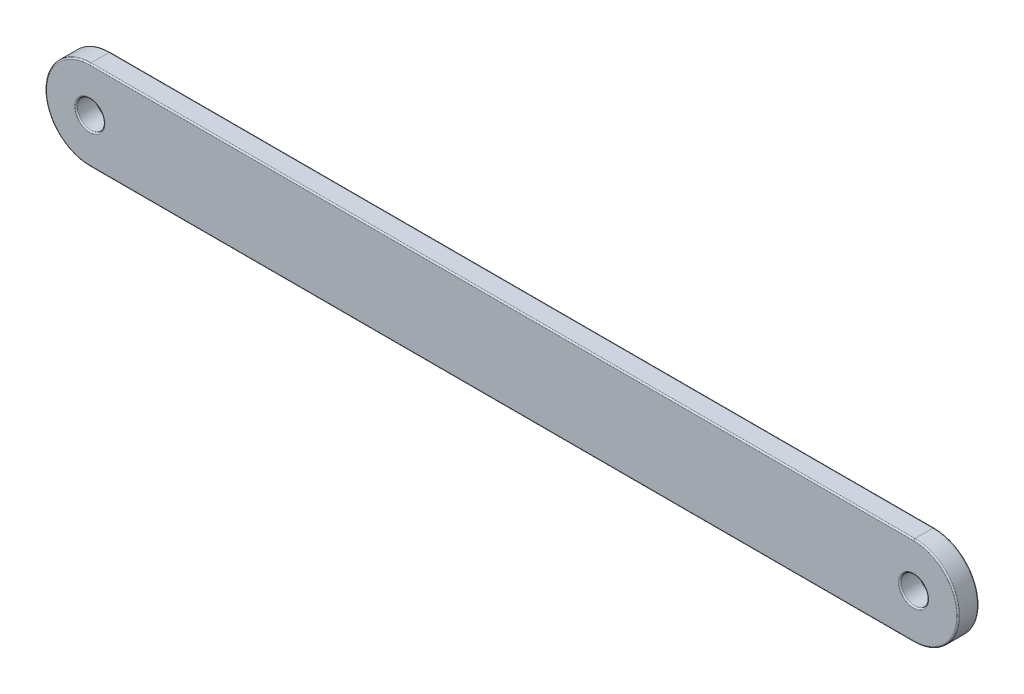
ISO-10303-21;
HEADER;
FILE_DESCRIPTION(('STEP AP214'),'2;1');
FILE_NAME('part.step','',(''),(''),'','','');
FILE_SCHEMA(('AUTOMOTIVE_DESIGN { 1 0 10303 214 1 1 1 1 }'));
ENDSEC;
DATA;
#1=APPLICATION_CONTEXT('core data for automotive mechanical design processes');
#2=APPLICATION_PROTOCOL_DEFINITION('international standard','automotive_design',2000,#1);
#3=PRODUCT_CONTEXT('',#1,'mechanical');
#4=PRODUCT('Part','Part','',(#3));
#5=PRODUCT_RELATED_PRODUCT_CATEGORY('part','',(#4));
#6=PRODUCT_DEFINITION_FORMATION('','',#4);
#7=PRODUCT_DEFINITION_CONTEXT('part definition',#1,'design');
#8=PRODUCT_DEFINITION('design','',#6,#7);
#9=PRODUCT_DEFINITION_SHAPE('','',#8);
#10=(LENGTH_UNIT() NAMED_UNIT(*) SI_UNIT(.MILLI.,.METRE.));
#11=(NAMED_UNIT(*) PLANE_ANGLE_UNIT() SI_UNIT($,.RADIAN.));
#12=(NAMED_UNIT(*) SI_UNIT($,.STERADIAN.) SOLID_ANGLE_UNIT());
#13=UNCERTAINTY_MEASURE_WITH_UNIT(LENGTH_MEASURE(1.E-05),#10,'distance_accuracy_value','');
#14=(GEOMETRIC_REPRESENTATION_CONTEXT(3) GLOBAL_UNCERTAINTY_ASSIGNED_CONTEXT((#13)) GLOBAL_UNIT_ASSIGNED_CONTEXT((#10,
#11,#12)) REPRESENTATION_CONTEXT('',''));
#15=CARTESIAN_POINT('',(0.,0.,0.));
#16=DIRECTION('',(0.,0.,1.));
#17=DIRECTION('',(1.,0.,0.));
#18=AXIS2_PLACEMENT_3D('',#15,#16,#17);
#19=CARTESIAN_POINT('',(-30.,0.,0.75));
#20=DIRECTION('',(0.,0.,1.));
#21=DIRECTION('',(1.,0.,0.));
#22=AXIS2_PLACEMENT_3D('',#19,#20,#21);
#23=PLANE('',#22);
#24=CARTESIAN_POINT('',(30.,0.,0.75));
#25=DIRECTION('',(0.,0.,1.));
#26=DIRECTION('',(1.,0.,0.));
#27=AXIS2_PLACEMENT_3D('',#24,#25,#26);
#28=CIRCLE('',#27,1.1);
#29=CARTESIAN_POINT('',(31.1,0.,0.75));
#30=VERTEX_POINT('',#29);
#31=EDGE_CURVE('E11',#30,#30,#28,.F.);
#32=ORIENTED_EDGE('',*,*,#31,.T.);
#33=EDGE_LOOP('',(#32));
#34=FACE_BOUND('',#33,.T.);
#35=CARTESIAN_POINT('',(30.,0.,0.75));
#36=DIRECTION('',(0.,0.,1.));
#37=DIRECTION('',(1.,0.,0.));
#38=AXIS2_PLACEMENT_3D('',#35,#36,#37);
#39=CIRCLE('',#38,3.15);
#40=CARTESIAN_POINT('',(30.,-3.14999999999999,0.75));
#41=VERTEX_POINT('',#40);
#42=CARTESIAN_POINT('',(30.,3.15000000000001,0.75));
#43=VERTEX_POINT('',#42);
#44=EDGE_CURVE('E61',#41,#43,#39,.T.);
#45=ORIENTED_EDGE('',*,*,#44,.T.);
#46=DIRECTION('',(-1.,0.,0.));
#47=VECTOR('',#46,1.);
#48=CARTESIAN_POINT('',(-30.,3.15,0.75));
#49=LINE('',#48,#47);
#50=CARTESIAN_POINT('',(-30.,3.15,0.75));
#51=VERTEX_POINT('',#50);
#52=EDGE_CURVE('E53',#43,#51,#49,.T.);
#53=ORIENTED_EDGE('',*,*,#52,.T.);
#54=CARTESIAN_POINT('',(-30.,0.,0.75));
#55=DIRECTION('',(0.,0.,1.));
#56=DIRECTION('',(1.,0.,0.));
#57=AXIS2_PLACEMENT_3D('',#54,#55,#56);
#58=CIRCLE('',#57,3.15);
#59=CARTESIAN_POINT('',(-30.,-3.15,0.75));
#60=VERTEX_POINT('',#59);
#61=EDGE_CURVE('E198',#51,#60,#58,.T.);
#62=ORIENTED_EDGE('',*,*,#61,.T.);
#63=DIRECTION('',(1.,0.,0.));
#64=VECTOR('',#63,1.);
#65=CARTESIAN_POINT('',(30.,-3.14999999999999,0.75));
#66=LINE('',#65,#64);
#67=EDGE_CURVE('E66',#60,#41,#66,.T.);
#68=ORIENTED_EDGE('',*,*,#67,.T.);
#69=EDGE_LOOP('',(#45,#53,#62,#68));
#70=FACE_BOUND('',#69,.T.);
#71=CARTESIAN_POINT('',(-30.,0.,0.75));
#72=DIRECTION('',(0.,0.,1.));
#73=DIRECTION('',(1.,0.,0.));
#74=AXIS2_PLACEMENT_3D('',#71,#72,#73);
#75=CIRCLE('',#74,1.1);
#76=CARTESIAN_POINT('',(-28.9,0.,0.75));
#77=VERTEX_POINT('',#76);
#78=EDGE_CURVE('E194',#77,#77,#75,.F.);
#79=ORIENTED_EDGE('',*,*,#78,.T.);
#80=EDGE_LOOP('',(#79));
#81=FACE_BOUND('',#80,.T.);
#82=ADVANCED_FACE('F43',(#34,#70,#81),#23,.T.);
#83=CARTESIAN_POINT('',(-30.,0.,-0.75));
#84=DIRECTION('',(0.,0.,1.));
#85=DIRECTION('',(1.,0.,0.));
#86=AXIS2_PLACEMENT_3D('',#83,#84,#85);
#87=PLANE('',#86);
#88=CARTESIAN_POINT('',(30.,0.,-0.75));
#89=DIRECTION('',(0.,0.,1.));
#90=DIRECTION('',(1.,0.,0.));
#91=AXIS2_PLACEMENT_3D('',#88,#89,#90);
#92=CIRCLE('',#91,1.1);
#93=CARTESIAN_POINT('',(31.1,0.,-0.75));
#94=VERTEX_POINT('',#93);
#95=EDGE_CURVE('E146',#94,#94,#92,.T.);
#96=ORIENTED_EDGE('',*,*,#95,.T.);
#97=EDGE_LOOP('',(#96));
#98=FACE_BOUND('',#97,.T.);
#99=CARTESIAN_POINT('',(-30.,0.,-0.75));
#100=DIRECTION('',(0.,0.,1.));
#101=DIRECTION('',(1.,0.,0.));
#102=AXIS2_PLACEMENT_3D('',#99,#100,#101);
#103=CIRCLE('',#102,1.1);
#104=CARTESIAN_POINT('',(-28.9,0.,-0.75));
#105=VERTEX_POINT('',#104);
#106=EDGE_CURVE('E141',#105,#105,#103,.T.);
#107=ORIENTED_EDGE('',*,*,#106,.T.);
#108=EDGE_LOOP('',(#107));
#109=FACE_BOUND('',#108,.T.);
#110=CARTESIAN_POINT('',(30.,0.,-0.75));
#111=DIRECTION('',(0.,0.,1.));
#112=DIRECTION('',(1.,0.,0.));
#113=AXIS2_PLACEMENT_3D('',#110,#111,#112);
#114=CIRCLE('',#113,3.15);
#115=CARTESIAN_POINT('',(30.,3.15000000000001,-0.75));
#116=VERTEX_POINT('',#115);
#117=CARTESIAN_POINT('',(30.,-3.14999999999999,-0.75));
#118=VERTEX_POINT('',#117);
#119=EDGE_CURVE('E139',#116,#118,#114,.F.);
#120=ORIENTED_EDGE('',*,*,#119,.T.);
#121=DIRECTION('',(1.,0.,0.));
#122=VECTOR('',#121,1.);
#123=CARTESIAN_POINT('',(-30.,-3.15,-0.75));
#124=LINE('',#123,#122);
#125=CARTESIAN_POINT('',(-30.,-3.15,-0.75));
#126=VERTEX_POINT('',#125);
#127=EDGE_CURVE('E116',#118,#126,#124,.F.);
#128=ORIENTED_EDGE('',*,*,#127,.T.);
#129=CARTESIAN_POINT('',(-30.,0.,-0.75));
#130=DIRECTION('',(0.,0.,1.));
#131=DIRECTION('',(1.,0.,0.));
#132=AXIS2_PLACEMENT_3D('',#129,#130,#131);
#133=CIRCLE('',#132,3.15);
#134=CARTESIAN_POINT('',(-30.,3.15,-0.75));
#135=VERTEX_POINT('',#134);
#136=EDGE_CURVE('E127',#126,#135,#133,.F.);
#137=ORIENTED_EDGE('',*,*,#136,.T.);
#138=DIRECTION('',(-1.,0.,0.));
#139=VECTOR('',#138,1.);
#140=CARTESIAN_POINT('',(-30.,3.15,-0.75));
#141=LINE('',#140,#139);
#142=EDGE_CURVE('E134',#135,#116,#141,.F.);
#143=ORIENTED_EDGE('',*,*,#142,.T.);
#144=EDGE_LOOP('',(#120,#128,#137,#143));
#145=FACE_BOUND('',#144,.T.);
#146=ADVANCED_FACE('F137',(#98,#109,#145),#87,.F.);
#147=CARTESIAN_POINT('',(-30.,0.,0.75));
#148=DIRECTION('',(0.,0.,-1.));
#149=DIRECTION('',(-1.,0.,0.));
#150=AXIS2_PLACEMENT_3D('',#147,#148,#149);
#151=CYLINDRICAL_SURFACE('',#150,3.25);
#152=DIRECTION('',(0.,0.,-1.));
#153=VECTOR('',#152,1.);
#154=CARTESIAN_POINT('',(-30.,3.25,0.75));
#155=LINE('',#154,#153);
#156=CARTESIAN_POINT('',(-30.,3.25,0.65));
#157=VERTEX_POINT('',#156);
#158=CARTESIAN_POINT('',(-30.,3.25,-0.65));
#159=VERTEX_POINT('',#158);
#160=EDGE_CURVE('E214',#157,#159,#155,.T.);
#161=ORIENTED_EDGE('',*,*,#160,.T.);
#162=CARTESIAN_POINT('',(-30.,0.,-0.65));
#163=DIRECTION('',(0.,0.,1.));
#164=DIRECTION('',(1.,0.,0.));
#165=AXIS2_PLACEMENT_3D('',#162,#163,#164);
#166=CIRCLE('',#165,3.25);
#167=CARTESIAN_POINT('',(-30.,-3.25,-0.65));
#168=VERTEX_POINT('',#167);
#169=EDGE_CURVE('E191',#159,#168,#166,.T.);
#170=ORIENTED_EDGE('',*,*,#169,.T.);
#171=DIRECTION('',(0.,0.,-1.));
#172=VECTOR('',#171,1.);
#173=CARTESIAN_POINT('',(-30.,-3.25,0.75));
#174=LINE('',#173,#172);
#175=CARTESIAN_POINT('',(-30.,-3.25,0.65));
#176=VERTEX_POINT('',#175);
#177=EDGE_CURVE('E135',#176,#168,#174,.T.);
#178=ORIENTED_EDGE('',*,*,#177,.F.);
#179=CARTESIAN_POINT('',(-30.,0.,0.65));
#180=DIRECTION('',(0.,0.,1.));
#181=DIRECTION('',(1.,0.,0.));
#182=AXIS2_PLACEMENT_3D('',#179,#180,#181);
#183=CIRCLE('',#182,3.25);
#184=EDGE_CURVE('E188',#176,#157,#183,.F.);
#185=ORIENTED_EDGE('',*,*,#184,.T.);
#186=EDGE_LOOP('',(#161,#170,#178,#185));
#187=FACE_BOUND('',#186,.T.);
#188=ADVANCED_FACE('F244',(#187),#151,.T.);
#189=CARTESIAN_POINT('',(-30.,-3.25,0.75));
#190=DIRECTION('',(0.,1.,0.));
#191=DIRECTION('',(-1.,0.,0.));
#192=AXIS2_PLACEMENT_3D('',#189,#190,#191);
#193=PLANE('',#192);
#194=ORIENTED_EDGE('',*,*,#177,.T.);
#195=DIRECTION('',(1.,0.,0.));
#196=VECTOR('',#195,1.);
#197=CARTESIAN_POINT('',(-30.,-3.25,-0.65));
#198=LINE('',#197,#196);
#199=CARTESIAN_POINT('',(30.,-3.24999999999999,-0.65));
#200=VERTEX_POINT('',#199);
#201=EDGE_CURVE('E119',#168,#200,#198,.T.);
#202=ORIENTED_EDGE('',*,*,#201,.T.);
#203=DIRECTION('',(0.,0.,-1.));
#204=VECTOR('',#203,1.);
#205=CARTESIAN_POINT('',(30.,-3.24999999999999,0.75));
#206=LINE('',#205,#204);
#207=CARTESIAN_POINT('',(30.,-3.24999999999999,0.65));
#208=VERTEX_POINT('',#207);
#209=EDGE_CURVE('E241',#208,#200,#206,.T.);
#210=ORIENTED_EDGE('',*,*,#209,.F.);
#211=DIRECTION('',(1.,0.,0.));
#212=VECTOR('',#211,1.);
#213=CARTESIAN_POINT('',(-30.,-3.25,0.65));
#214=LINE('',#213,#212);
#215=EDGE_CURVE('E170',#208,#176,#214,.F.);
#216=ORIENTED_EDGE('',*,*,#215,.T.);
#217=EDGE_LOOP('',(#194,#202,#210,#216));
#218=FACE_BOUND('',#217,.T.);
#219=ADVANCED_FACE('F239',(#218),#193,.F.);
#220=CARTESIAN_POINT('',(30.,0.,0.75));
#221=DIRECTION('',(0.,0.,-1.));
#222=DIRECTION('',(-1.,0.,0.));
#223=AXIS2_PLACEMENT_3D('',#220,#221,#222);
#224=CYLINDRICAL_SURFACE('',#223,3.25);
#225=ORIENTED_EDGE('',*,*,#209,.T.);
#226=CARTESIAN_POINT('',(30.,0.,-0.65));
#227=DIRECTION('',(0.,0.,1.));
#228=DIRECTION('',(1.,0.,0.));
#229=AXIS2_PLACEMENT_3D('',#226,#227,#228);
#230=CIRCLE('',#229,3.25);
#231=CARTESIAN_POINT('',(30.,3.25000000000001,-0.65));
#232=VERTEX_POINT('',#231);
#233=EDGE_CURVE('E178',#200,#232,#230,.T.);
#234=ORIENTED_EDGE('',*,*,#233,.T.);
#235=DIRECTION('',(0.,0.,-1.));
#236=VECTOR('',#235,1.);
#237=CARTESIAN_POINT('',(30.,3.25000000000001,0.75));
#238=LINE('',#237,#236);
#239=CARTESIAN_POINT('',(30.,3.25000000000001,0.65));
#240=VERTEX_POINT('',#239);
#241=EDGE_CURVE('E249',#240,#232,#238,.T.);
#242=ORIENTED_EDGE('',*,*,#241,.F.);
#243=CARTESIAN_POINT('',(30.,0.,0.65));
#244=DIRECTION('',(0.,0.,1.));
#245=DIRECTION('',(1.,0.,0.));
#246=AXIS2_PLACEMENT_3D('',#243,#244,#245);
#247=CIRCLE('',#246,3.25);
#248=EDGE_CURVE('E175',#240,#208,#247,.F.);
#249=ORIENTED_EDGE('',*,*,#248,.T.);
#250=EDGE_LOOP('',(#225,#234,#242,#249));
#251=FACE_BOUND('',#250,.T.);
#252=ADVANCED_FACE('F263',(#251),#224,.T.);
#253=CARTESIAN_POINT('',(-30.,3.25,0.75));
#254=DIRECTION('',(0.,-1.,0.));
#255=DIRECTION('',(1.,0.,0.));
#256=AXIS2_PLACEMENT_3D('',#253,#254,#255);
#257=PLANE('',#256);
#258=ORIENTED_EDGE('',*,*,#241,.T.);
#259=DIRECTION('',(-1.,0.,0.));
#260=VECTOR('',#259,1.);
#261=CARTESIAN_POINT('',(-30.,3.25,-0.65));
#262=LINE('',#261,#260);
#263=EDGE_CURVE('E185',#232,#159,#262,.T.);
#264=ORIENTED_EDGE('',*,*,#263,.T.);
#265=ORIENTED_EDGE('',*,*,#160,.F.);
#266=DIRECTION('',(-1.,0.,0.));
#267=VECTOR('',#266,1.);
#268=CARTESIAN_POINT('',(30.,3.25000000000001,0.65));
#269=LINE('',#268,#267);
#270=EDGE_CURVE('E181',#157,#240,#269,.F.);
#271=ORIENTED_EDGE('',*,*,#270,.T.);
#272=EDGE_LOOP('',(#258,#264,#265,#271));
#273=FACE_BOUND('',#272,.T.);
#274=ADVANCED_FACE('F269',(#273),#257,.F.);
#275=CARTESIAN_POINT('',(-30.,0.,0.75));
#276=DIRECTION('',(0.,0.,-1.));
#277=DIRECTION('',(-1.,0.,0.));
#278=AXIS2_PLACEMENT_3D('',#275,#276,#277);
#279=CYLINDRICAL_SURFACE('',#278,1.);
#280=CARTESIAN_POINT('',(-30.,0.,-0.65));
#281=DIRECTION('',(0.,0.,1.));
#282=DIRECTION('',(1.,0.,0.));
#283=AXIS2_PLACEMENT_3D('',#280,#281,#282);
#284=CIRCLE('',#283,1.);
#285=CARTESIAN_POINT('',(-29.,0.,-0.65));
#286=VERTEX_POINT('',#285);
#287=EDGE_CURVE('E166',#286,#286,#284,.F.);
#288=ORIENTED_EDGE('',*,*,#287,.T.);
#289=EDGE_LOOP('',(#288));
#290=FACE_BOUND('',#289,.T.);
#291=CARTESIAN_POINT('',(-30.,0.,0.65));
#292=DIRECTION('',(0.,0.,1.));
#293=DIRECTION('',(1.,0.,0.));
#294=AXIS2_PLACEMENT_3D('',#291,#292,#293);
#295=CIRCLE('',#294,1.);
#296=CARTESIAN_POINT('',(-29.,0.,0.65));
#297=VERTEX_POINT('',#296);
#298=EDGE_CURVE('E162',#297,#297,#295,.T.);
#299=ORIENTED_EDGE('',*,*,#298,.T.);
#300=EDGE_LOOP('',(#299));
#301=FACE_BOUND('',#300,.T.);
#302=ADVANCED_FACE('F285',(#290,#301),#279,.F.);
#303=CARTESIAN_POINT('',(30.,0.,0.75));
#304=DIRECTION('',(0.,0.,-1.));
#305=DIRECTION('',(-1.,0.,0.));
#306=AXIS2_PLACEMENT_3D('',#303,#304,#305);
#307=CYLINDRICAL_SURFACE('',#306,1.);
#308=CARTESIAN_POINT('',(30.,0.,-0.65));
#309=DIRECTION('',(0.,0.,1.));
#310=DIRECTION('',(1.,0.,0.));
#311=AXIS2_PLACEMENT_3D('',#308,#309,#310);
#312=CIRCLE('',#311,1.);
#313=CARTESIAN_POINT('',(31.,0.,-0.65));
#314=VERTEX_POINT('',#313);
#315=EDGE_CURVE('E158',#314,#314,#312,.F.);
#316=ORIENTED_EDGE('',*,*,#315,.T.);
#317=EDGE_LOOP('',(#316));
#318=FACE_BOUND('',#317,.T.);
#319=CARTESIAN_POINT('',(30.,0.,0.65));
#320=DIRECTION('',(0.,0.,1.));
#321=DIRECTION('',(1.,0.,0.));
#322=AXIS2_PLACEMENT_3D('',#319,#320,#321);
#323=CIRCLE('',#322,1.);
#324=CARTESIAN_POINT('',(31.,0.,0.65));
#325=VERTEX_POINT('',#324);
#326=EDGE_CURVE('E154',#325,#325,#323,.T.);
#327=ORIENTED_EDGE('',*,*,#326,.T.);
#328=EDGE_LOOP('',(#327));
#329=FACE_BOUND('',#328,.T.);
#330=ADVANCED_FACE('F287',(#318,#329),#307,.F.);
#331=CARTESIAN_POINT('',(30.,0.,-0.65));
#332=DIRECTION('',(0.,0.,1.));
#333=DIRECTION('',(1.,0.,0.));
#334=AXIS2_PLACEMENT_3D('',#331,#332,#333);
#335=TOROIDAL_SURFACE('',#334,1.1,0.1);
#336=ORIENTED_EDGE('',*,*,#315,.F.);
#337=EDGE_LOOP('',(#336));
#338=FACE_BOUND('',#337,.T.);
#339=ORIENTED_EDGE('',*,*,#95,.F.);
#340=EDGE_LOOP('',(#339));
#341=FACE_BOUND('',#340,.T.);
#342=ADVANCED_FACE('F294',(#338,#341),#335,.T.);
#343=CARTESIAN_POINT('',(-30.,0.,-0.65));
#344=DIRECTION('',(0.,0.,1.));
#345=DIRECTION('',(1.,0.,0.));
#346=AXIS2_PLACEMENT_3D('',#343,#344,#345);
#347=TOROIDAL_SURFACE('',#346,1.1,0.1);
#348=ORIENTED_EDGE('',*,*,#287,.F.);
#349=EDGE_LOOP('',(#348));
#350=FACE_BOUND('',#349,.T.);
#351=ORIENTED_EDGE('',*,*,#106,.F.);
#352=EDGE_LOOP('',(#351));
#353=FACE_BOUND('',#352,.T.);
#354=ADVANCED_FACE('F310',(#350,#353),#347,.T.);
#355=CARTESIAN_POINT('',(-30.,3.15,-0.65));
#356=DIRECTION('',(-1.,0.,0.));
#357=DIRECTION('',(0.,-1.,0.));
#358=AXIS2_PLACEMENT_3D('',#355,#356,#357);
#359=CYLINDRICAL_SURFACE('',#358,0.1);
#360=CARTESIAN_POINT('',(30.,3.15000000000001,-0.65));
#361=DIRECTION('',(1.,0.,0.));
#362=DIRECTION('',(0.,0.,-1.));
#363=AXIS2_PLACEMENT_3D('',#360,#361,#362);
#364=CIRCLE('',#363,0.1);
#365=EDGE_CURVE('E123',#116,#232,#364,.T.);
#366=ORIENTED_EDGE('',*,*,#365,.F.);
#367=ORIENTED_EDGE('',*,*,#142,.F.);
#368=CARTESIAN_POINT('',(-30.,3.15,-0.65));
#369=DIRECTION('',(-1.,0.,0.));
#370=DIRECTION('',(0.,0.,1.));
#371=AXIS2_PLACEMENT_3D('',#368,#369,#370);
#372=CIRCLE('',#371,0.1);
#373=EDGE_CURVE('E130',#159,#135,#372,.T.);
#374=ORIENTED_EDGE('',*,*,#373,.F.);
#375=ORIENTED_EDGE('',*,*,#263,.F.);
#376=EDGE_LOOP('',(#366,#367,#374,#375));
#377=FACE_BOUND('',#376,.T.);
#378=ADVANCED_FACE('F256',(#377),#359,.T.);
#379=CARTESIAN_POINT('',(-30.,0.,-0.65));
#380=DIRECTION('',(0.,0.,1.));
#381=DIRECTION('',(1.,0.,0.));
#382=AXIS2_PLACEMENT_3D('',#379,#380,#381);
#383=TOROIDAL_SURFACE('',#382,3.15,0.1);
#384=ORIENTED_EDGE('',*,*,#373,.T.);
#385=ORIENTED_EDGE('',*,*,#136,.F.);
#386=CARTESIAN_POINT('',(-30.,-3.15,-0.65));
#387=DIRECTION('',(1.,0.,0.));
#388=DIRECTION('',(0.,0.,-1.));
#389=AXIS2_PLACEMENT_3D('',#386,#387,#388);
#390=CIRCLE('',#389,0.1);
#391=EDGE_CURVE('E112',#168,#126,#390,.T.);
#392=ORIENTED_EDGE('',*,*,#391,.F.);
#393=ORIENTED_EDGE('',*,*,#169,.F.);
#394=EDGE_LOOP('',(#384,#385,#392,#393));
#395=FACE_BOUND('',#394,.T.);
#396=ADVANCED_FACE('F128',(#395),#383,.T.);
#397=CARTESIAN_POINT('',(30.,0.,-0.65));
#398=DIRECTION('',(0.,0.,1.));
#399=DIRECTION('',(1.,0.,0.));
#400=AXIS2_PLACEMENT_3D('',#397,#398,#399);
#401=TOROIDAL_SURFACE('',#400,3.15,0.1);
#402=ORIENTED_EDGE('',*,*,#365,.T.);
#403=ORIENTED_EDGE('',*,*,#233,.F.);
#404=CARTESIAN_POINT('',(30.,-3.14999999999999,-0.65));
#405=DIRECTION('',(-1.,0.,0.));
#406=DIRECTION('',(0.,0.,1.));
#407=AXIS2_PLACEMENT_3D('',#404,#405,#406);
#408=CIRCLE('',#407,0.1);
#409=EDGE_CURVE('E124',#118,#200,#408,.T.);
#410=ORIENTED_EDGE('',*,*,#409,.F.);
#411=ORIENTED_EDGE('',*,*,#119,.F.);
#412=EDGE_LOOP('',(#402,#403,#410,#411));
#413=FACE_BOUND('',#412,.T.);
#414=ADVANCED_FACE('F259',(#413),#401,.T.);
#415=CARTESIAN_POINT('',(-30.,-3.15,-0.65));
#416=DIRECTION('',(1.,0.,0.));
#417=DIRECTION('',(0.,1.,0.));
#418=AXIS2_PLACEMENT_3D('',#415,#416,#417);
#419=CYLINDRICAL_SURFACE('',#418,0.1);
#420=ORIENTED_EDGE('',*,*,#391,.T.);
#421=ORIENTED_EDGE('',*,*,#127,.F.);
#422=ORIENTED_EDGE('',*,*,#409,.T.);
#423=ORIENTED_EDGE('',*,*,#201,.F.);
#424=EDGE_LOOP('',(#420,#421,#422,#423));
#425=FACE_BOUND('',#424,.T.);
#426=ADVANCED_FACE('F114',(#425),#419,.T.);
#427=CARTESIAN_POINT('',(30.,0.,0.65));
#428=DIRECTION('',(0.,0.,1.));
#429=DIRECTION('',(1.,0.,0.));
#430=AXIS2_PLACEMENT_3D('',#427,#428,#429);
#431=TOROIDAL_SURFACE('',#430,1.1,0.1);
#432=ORIENTED_EDGE('',*,*,#31,.F.);
#433=EDGE_LOOP('',(#432));
#434=FACE_BOUND('',#433,.T.);
#435=ORIENTED_EDGE('',*,*,#326,.F.);
#436=EDGE_LOOP('',(#435));
#437=FACE_BOUND('',#436,.T.);
#438=ADVANCED_FACE('F317',(#434,#437),#431,.T.);
#439=CARTESIAN_POINT('',(-30.,-3.15,0.65));
#440=DIRECTION('',(-1.,0.,0.));
#441=DIRECTION('',(0.,-1.,0.));
#442=AXIS2_PLACEMENT_3D('',#439,#440,#441);
#443=CYLINDRICAL_SURFACE('',#442,0.1);
#444=CARTESIAN_POINT('',(-30.,-3.15,0.65));
#445=DIRECTION('',(-1.,0.,0.));
#446=DIRECTION('',(0.,0.,1.));
#447=AXIS2_PLACEMENT_3D('',#444,#445,#446);
#448=CIRCLE('',#447,0.1);
#449=EDGE_CURVE('E220',#176,#60,#448,.T.);
#450=ORIENTED_EDGE('',*,*,#449,.F.);
#451=ORIENTED_EDGE('',*,*,#215,.F.);
#452=CARTESIAN_POINT('',(30.,-3.14999999999999,0.65));
#453=DIRECTION('',(1.,0.,0.));
#454=DIRECTION('',(0.,0.,-1.));
#455=AXIS2_PLACEMENT_3D('',#452,#453,#454);
#456=CIRCLE('',#455,0.1);
#457=EDGE_CURVE('E47',#41,#208,#456,.T.);
#458=ORIENTED_EDGE('',*,*,#457,.F.);
#459=ORIENTED_EDGE('',*,*,#67,.F.);
#460=EDGE_LOOP('',(#450,#451,#458,#459));
#461=FACE_BOUND('',#460,.T.);
#462=ADVANCED_FACE('F234',(#461),#443,.T.);
#463=CARTESIAN_POINT('',(30.,0.,0.65));
#464=DIRECTION('',(0.,0.,1.));
#465=DIRECTION('',(1.,0.,0.));
#466=AXIS2_PLACEMENT_3D('',#463,#464,#465);
#467=TOROIDAL_SURFACE('',#466,3.15,0.1);
#468=ORIENTED_EDGE('',*,*,#457,.T.);
#469=ORIENTED_EDGE('',*,*,#248,.F.);
#470=CARTESIAN_POINT('',(30.,3.15000000000001,0.65));
#471=DIRECTION('',(-1.,0.,0.));
#472=DIRECTION('',(0.,0.,1.));
#473=AXIS2_PLACEMENT_3D('',#470,#471,#472);
#474=CIRCLE('',#473,0.1);
#475=EDGE_CURVE('E218',#43,#240,#474,.T.);
#476=ORIENTED_EDGE('',*,*,#475,.F.);
#477=ORIENTED_EDGE('',*,*,#44,.F.);
#478=EDGE_LOOP('',(#468,#469,#476,#477));
#479=FACE_BOUND('',#478,.T.);
#480=ADVANCED_FACE('F231',(#479),#467,.T.);
#481=CARTESIAN_POINT('',(-30.,0.,0.65));
#482=DIRECTION('',(0.,0.,1.));
#483=DIRECTION('',(1.,0.,0.));
#484=AXIS2_PLACEMENT_3D('',#481,#482,#483);
#485=TOROIDAL_SURFACE('',#484,3.15,0.1);
#486=ORIENTED_EDGE('',*,*,#449,.T.);
#487=ORIENTED_EDGE('',*,*,#61,.F.);
#488=CARTESIAN_POINT('',(-30.,3.15,0.65));
#489=DIRECTION('',(1.,0.,0.));
#490=DIRECTION('',(0.,0.,-1.));
#491=AXIS2_PLACEMENT_3D('',#488,#489,#490);
#492=CIRCLE('',#491,0.1);
#493=EDGE_CURVE('E215',#157,#51,#492,.T.);
#494=ORIENTED_EDGE('',*,*,#493,.F.);
#495=ORIENTED_EDGE('',*,*,#184,.F.);
#496=EDGE_LOOP('',(#486,#487,#494,#495));
#497=FACE_BOUND('',#496,.T.);
#498=ADVANCED_FACE('F274',(#497),#485,.T.);
#499=CARTESIAN_POINT('',(-30.,3.15,0.65));
#500=DIRECTION('',(1.,0.,0.));
#501=DIRECTION('',(0.,1.,0.));
#502=AXIS2_PLACEMENT_3D('',#499,#500,#501);
#503=CYLINDRICAL_SURFACE('',#502,0.1);
#504=ORIENTED_EDGE('',*,*,#475,.T.);
#505=ORIENTED_EDGE('',*,*,#270,.F.);
#506=ORIENTED_EDGE('',*,*,#493,.T.);
#507=ORIENTED_EDGE('',*,*,#52,.F.);
#508=EDGE_LOOP('',(#504,#505,#506,#507));
#509=FACE_BOUND('',#508,.T.);
#510=ADVANCED_FACE('F272',(#509),#503,.T.);
#511=CARTESIAN_POINT('',(-30.,0.,0.65));
#512=DIRECTION('',(0.,0.,1.));
#513=DIRECTION('',(1.,0.,0.));
#514=AXIS2_PLACEMENT_3D('',#511,#512,#513);
#515=TOROIDAL_SURFACE('',#514,1.1,0.1);
#516=ORIENTED_EDGE('',*,*,#78,.F.);
#517=EDGE_LOOP('',(#516));
#518=FACE_BOUND('',#517,.T.);
#519=ORIENTED_EDGE('',*,*,#298,.F.);
#520=EDGE_LOOP('',(#519));
#521=FACE_BOUND('',#520,.T.);
#522=ADVANCED_FACE('F45',(#518,#521),#515,.T.);
#523=CLOSED_SHELL('',(#82,#146,#188,#219,#252,#274,#302,#330,#342,#354,#378,#396,#414,#426,#438,
#462,#480,#498,#510,#522));
#524=MANIFOLD_SOLID_BREP('B2',#523);
#525=ADVANCED_BREP_SHAPE_REPRESENTATION('',(#18,#524),#14);
#526=SHAPE_DEFINITION_REPRESENTATION(#9,#525);
ENDSEC;
END-ISO-10303-21;
